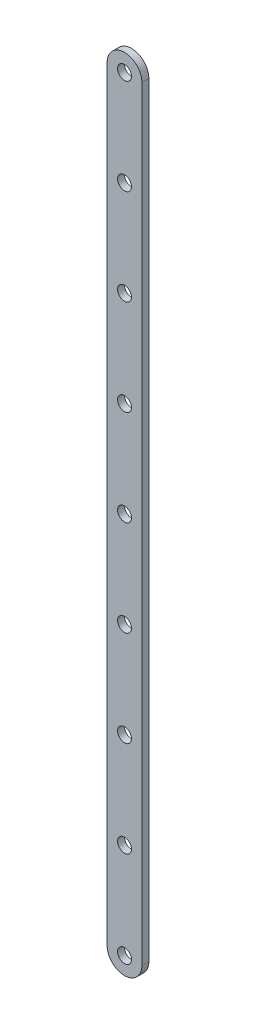
ISO-10303-21;
HEADER;
FILE_DESCRIPTION(('STEP AP214'),'2;1');
FILE_NAME('part.step','',(''),(''),'','','');
FILE_SCHEMA(('AUTOMOTIVE_DESIGN { 1 0 10303 214 1 1 1 1 }'));
ENDSEC;
DATA;
#1=APPLICATION_CONTEXT('core data for automotive mechanical design processes');
#2=APPLICATION_PROTOCOL_DEFINITION('international standard','automotive_design',2000,#1);
#3=PRODUCT_CONTEXT('',#1,'mechanical');
#4=PRODUCT('Part','Part','',(#3));
#5=PRODUCT_RELATED_PRODUCT_CATEGORY('part','',(#4));
#6=PRODUCT_DEFINITION_FORMATION('','',#4);
#7=PRODUCT_DEFINITION_CONTEXT('part definition',#1,'design');
#8=PRODUCT_DEFINITION('design','',#6,#7);
#9=PRODUCT_DEFINITION_SHAPE('','',#8);
#10=(LENGTH_UNIT() NAMED_UNIT(*) SI_UNIT(.MILLI.,.METRE.));
#11=(NAMED_UNIT(*) PLANE_ANGLE_UNIT() SI_UNIT($,.RADIAN.));
#12=(NAMED_UNIT(*) SI_UNIT($,.STERADIAN.) SOLID_ANGLE_UNIT());
#13=UNCERTAINTY_MEASURE_WITH_UNIT(LENGTH_MEASURE(1.E-05),#10,'distance_accuracy_value','');
#14=(GEOMETRIC_REPRESENTATION_CONTEXT(3) GLOBAL_UNCERTAINTY_ASSIGNED_CONTEXT((#13)) GLOBAL_UNIT_ASSIGNED_CONTEXT((#10,
#11,#12)) REPRESENTATION_CONTEXT('',''));
#15=CARTESIAN_POINT('',(0.,0.,0.));
#16=DIRECTION('',(0.,0.,1.));
#17=DIRECTION('',(1.,0.,0.));
#18=AXIS2_PLACEMENT_3D('',#15,#16,#17);
#19=CARTESIAN_POINT('',(0.,-275.,5.));
#20=DIRECTION('',(0.,0.,1.));
#21=DIRECTION('',(1.,0.,0.));
#22=AXIS2_PLACEMENT_3D('',#19,#20,#21);
#23=PLANE('',#22);
#24=CARTESIAN_POINT('',(-5.76094420909117E-12,137.5,5.));
#25=DIRECTION('',(0.,0.,1.));
#26=DIRECTION('',(1.,0.,0.));
#27=AXIS2_PLACEMENT_3D('',#24,#25,#26);
#28=CIRCLE('',#27,4.99999999999999);
#29=CARTESIAN_POINT('',(4.99999999999423,137.5,5.));
#30=VERTEX_POINT('',#29);
#31=EDGE_CURVE('E178',#30,#30,#28,.T.);
#32=ORIENTED_EDGE('',*,*,#31,.F.);
#33=EDGE_LOOP('',(#32));
#34=FACE_BOUND('',#33,.T.);
#35=CARTESIAN_POINT('',(-3.84062947272745E-12,0.,5.));
#36=DIRECTION('',(0.,0.,1.));
#37=DIRECTION('',(1.,0.,0.));
#38=AXIS2_PLACEMENT_3D('',#35,#36,#37);
#39=CIRCLE('',#38,4.99999999999999);
#40=CARTESIAN_POINT('',(4.99999999999615,0.,5.));
#41=VERTEX_POINT('',#40);
#42=EDGE_CURVE('E166',#41,#41,#39,.T.);
#43=ORIENTED_EDGE('',*,*,#42,.F.);
#44=EDGE_LOOP('',(#43));
#45=FACE_BOUND('',#44,.T.);
#46=CARTESIAN_POINT('',(-1.92031473636372E-12,-137.5,5.));
#47=DIRECTION('',(0.,0.,1.));
#48=DIRECTION('',(1.,0.,0.));
#49=AXIS2_PLACEMENT_3D('',#46,#47,#48);
#50=CIRCLE('',#49,4.99999999999999);
#51=CARTESIAN_POINT('',(4.99999999999807,-137.5,5.));
#52=VERTEX_POINT('',#51);
#53=EDGE_CURVE('E154',#52,#52,#50,.T.);
#54=ORIENTED_EDGE('',*,*,#53,.F.);
#55=EDGE_LOOP('',(#54));
#56=FACE_BOUND('',#55,.T.);
#57=CARTESIAN_POINT('',(-6.72110157727303E-12,206.25,5.));
#58=DIRECTION('',(0.,0.,1.));
#59=DIRECTION('',(1.,0.,0.));
#60=AXIS2_PLACEMENT_3D('',#57,#58,#59);
#61=CIRCLE('',#60,4.99999999999999);
#62=CARTESIAN_POINT('',(4.99999999999327,206.25,5.));
#63=VERTEX_POINT('',#62);
#64=EDGE_CURVE('E141',#63,#63,#61,.T.);
#65=ORIENTED_EDGE('',*,*,#64,.F.);
#66=EDGE_LOOP('',(#65));
#67=FACE_BOUND('',#66,.T.);
#68=CARTESIAN_POINT('',(0.,-275.,5.));
#69=DIRECTION('',(0.,0.,1.));
#70=DIRECTION('',(1.,0.,0.));
#71=AXIS2_PLACEMENT_3D('',#68,#69,#70);
#72=CIRCLE('',#71,12.5);
#73=CARTESIAN_POINT('',(-12.5,-275.,5.));
#74=VERTEX_POINT('',#73);
#75=CARTESIAN_POINT('',(12.5,-275.,5.));
#76=VERTEX_POINT('',#75);
#77=EDGE_CURVE('E105',#74,#76,#72,.T.);
#78=ORIENTED_EDGE('',*,*,#77,.T.);
#79=DIRECTION('',(0.,1.,0.));
#80=VECTOR('',#79,1.);
#81=CARTESIAN_POINT('',(12.5,-275.,5.));
#82=LINE('',#81,#80);
#83=CARTESIAN_POINT('',(12.5,275.,5.));
#84=VERTEX_POINT('',#83);
#85=EDGE_CURVE('E100',#76,#84,#82,.T.);
#86=ORIENTED_EDGE('',*,*,#85,.T.);
#87=CARTESIAN_POINT('',(0.,275.,5.));
#88=DIRECTION('',(0.,0.,1.));
#89=DIRECTION('',(-1.,0.,0.));
#90=AXIS2_PLACEMENT_3D('',#87,#88,#89);
#91=CIRCLE('',#90,12.5);
#92=CARTESIAN_POINT('',(-12.5,275.,5.));
#93=VERTEX_POINT('',#92);
#94=EDGE_CURVE('E103',#84,#93,#91,.T.);
#95=ORIENTED_EDGE('',*,*,#94,.T.);
#96=DIRECTION('',(0.,-1.,0.));
#97=VECTOR('',#96,1.);
#98=CARTESIAN_POINT('',(-12.5,-275.,5.));
#99=LINE('',#98,#97);
#100=EDGE_CURVE('E68',#93,#74,#99,.T.);
#101=ORIENTED_EDGE('',*,*,#100,.T.);
#102=EDGE_LOOP('',(#78,#86,#95,#101));
#103=FACE_BOUND('',#102,.T.);
#104=CARTESIAN_POINT('',(0.,-275.,5.));
#105=DIRECTION('',(0.,0.,1.));
#106=DIRECTION('',(1.,0.,0.));
#107=AXIS2_PLACEMENT_3D('',#104,#105,#106);
#108=CIRCLE('',#107,4.99999999999999);
#109=CARTESIAN_POINT('',(4.99999999999996,-275.,5.));
#110=VERTEX_POINT('',#109);
#111=EDGE_CURVE('E124',#110,#110,#108,.T.);
#112=ORIENTED_EDGE('',*,*,#111,.F.);
#113=EDGE_LOOP('',(#112));
#114=FACE_BOUND('',#113,.T.);
#115=CARTESIAN_POINT('',(-9.60157368181862E-13,-206.25,5.));
#116=DIRECTION('',(0.,0.,1.));
#117=DIRECTION('',(1.,0.,0.));
#118=AXIS2_PLACEMENT_3D('',#115,#116,#117);
#119=CIRCLE('',#118,4.99999999999999);
#120=CARTESIAN_POINT('',(4.99999999999903,-206.25,5.));
#121=VERTEX_POINT('',#120);
#122=EDGE_CURVE('E148',#121,#121,#119,.T.);
#123=ORIENTED_EDGE('',*,*,#122,.F.);
#124=EDGE_LOOP('',(#123));
#125=FACE_BOUND('',#124,.T.);
#126=CARTESIAN_POINT('',(-2.88047210454559E-12,-68.75,5.));
#127=DIRECTION('',(0.,0.,1.));
#128=DIRECTION('',(1.,0.,0.));
#129=AXIS2_PLACEMENT_3D('',#126,#127,#128);
#130=CIRCLE('',#129,4.99999999999999);
#131=CARTESIAN_POINT('',(4.99999999999711,-68.75,5.));
#132=VERTEX_POINT('',#131);
#133=EDGE_CURVE('E160',#132,#132,#130,.T.);
#134=ORIENTED_EDGE('',*,*,#133,.F.);
#135=EDGE_LOOP('',(#134));
#136=FACE_BOUND('',#135,.T.);
#137=CARTESIAN_POINT('',(-4.80078684090931E-12,68.75,5.));
#138=DIRECTION('',(0.,0.,1.));
#139=DIRECTION('',(1.,0.,0.));
#140=AXIS2_PLACEMENT_3D('',#137,#138,#139);
#141=CIRCLE('',#140,4.99999999999999);
#142=CARTESIAN_POINT('',(4.99999999999519,68.75,5.));
#143=VERTEX_POINT('',#142);
#144=EDGE_CURVE('E172',#143,#143,#141,.T.);
#145=ORIENTED_EDGE('',*,*,#144,.F.);
#146=EDGE_LOOP('',(#145));
#147=FACE_BOUND('',#146,.T.);
#148=CARTESIAN_POINT('',(0.,275.,5.));
#149=DIRECTION('',(0.,0.,1.));
#150=DIRECTION('',(1.,0.,0.));
#151=AXIS2_PLACEMENT_3D('',#148,#149,#150);
#152=CIRCLE('',#151,4.99999999999998);
#153=CARTESIAN_POINT('',(4.99999999999995,275.,5.));
#154=VERTEX_POINT('',#153);
#155=EDGE_CURVE('E184',#154,#154,#152,.T.);
#156=ORIENTED_EDGE('',*,*,#155,.F.);
#157=EDGE_LOOP('',(#156));
#158=FACE_BOUND('',#157,.T.);
#159=ADVANCED_FACE('F51',(#34,#45,#56,#67,#103,#114,#125,#136,#147,#158),#23,.T.);
#160=CARTESIAN_POINT('',(0.,-275.,0.));
#161=DIRECTION('',(0.,0.,1.));
#162=DIRECTION('',(1.,0.,0.));
#163=AXIS2_PLACEMENT_3D('',#160,#161,#162);
#164=PLANE('',#163);
#165=CARTESIAN_POINT('',(0.,-275.,0.));
#166=DIRECTION('',(0.,0.,1.));
#167=DIRECTION('',(1.,0.,0.));
#168=AXIS2_PLACEMENT_3D('',#165,#166,#167);
#169=CIRCLE('',#168,12.5);
#170=CARTESIAN_POINT('',(-12.5,-275.,0.));
#171=VERTEX_POINT('',#170);
#172=CARTESIAN_POINT('',(12.5,-275.,0.));
#173=VERTEX_POINT('',#172);
#174=EDGE_CURVE('E121',#171,#173,#169,.T.);
#175=ORIENTED_EDGE('',*,*,#174,.F.);
#176=DIRECTION('',(0.,-1.,0.));
#177=VECTOR('',#176,1.);
#178=CARTESIAN_POINT('',(-12.5,-275.,0.));
#179=LINE('',#178,#177);
#180=CARTESIAN_POINT('',(-12.5,275.,0.));
#181=VERTEX_POINT('',#180);
#182=EDGE_CURVE('E93',#181,#171,#179,.T.);
#183=ORIENTED_EDGE('',*,*,#182,.F.);
#184=CARTESIAN_POINT('',(0.,275.,0.));
#185=DIRECTION('',(0.,0.,1.));
#186=DIRECTION('',(-1.,0.,0.));
#187=AXIS2_PLACEMENT_3D('',#184,#185,#186);
#188=CIRCLE('',#187,12.5);
#189=CARTESIAN_POINT('',(12.5,275.,0.));
#190=VERTEX_POINT('',#189);
#191=EDGE_CURVE('E87',#190,#181,#188,.T.);
#192=ORIENTED_EDGE('',*,*,#191,.F.);
#193=DIRECTION('',(0.,1.,0.));
#194=VECTOR('',#193,1.);
#195=CARTESIAN_POINT('',(12.5,-275.,0.));
#196=LINE('',#195,#194);
#197=EDGE_CURVE('E109',#173,#190,#196,.T.);
#198=ORIENTED_EDGE('',*,*,#197,.F.);
#199=EDGE_LOOP('',(#175,#183,#192,#198));
#200=FACE_BOUND('',#199,.T.);
#201=CARTESIAN_POINT('',(0.,-275.,0.));
#202=DIRECTION('',(0.,0.,1.));
#203=DIRECTION('',(1.,0.,0.));
#204=AXIS2_PLACEMENT_3D('',#201,#202,#203);
#205=CIRCLE('',#204,4.99999999999999);
#206=CARTESIAN_POINT('',(4.99999999999996,-275.,0.));
#207=VERTEX_POINT('',#206);
#208=EDGE_CURVE('E138',#207,#207,#205,.T.);
#209=ORIENTED_EDGE('',*,*,#208,.T.);
#210=EDGE_LOOP('',(#209));
#211=FACE_BOUND('',#210,.T.);
#212=CARTESIAN_POINT('',(-6.72110157727303E-12,206.25,0.));
#213=DIRECTION('',(0.,0.,1.));
#214=DIRECTION('',(1.,0.,0.));
#215=AXIS2_PLACEMENT_3D('',#212,#213,#214);
#216=CIRCLE('',#215,4.99999999999999);
#217=CARTESIAN_POINT('',(4.99999999999327,206.25,0.));
#218=VERTEX_POINT('',#217);
#219=EDGE_CURVE('E144',#218,#218,#216,.T.);
#220=ORIENTED_EDGE('',*,*,#219,.T.);
#221=EDGE_LOOP('',(#220));
#222=FACE_BOUND('',#221,.T.);
#223=CARTESIAN_POINT('',(-9.60157368181862E-13,-206.25,0.));
#224=DIRECTION('',(0.,0.,1.));
#225=DIRECTION('',(1.,0.,0.));
#226=AXIS2_PLACEMENT_3D('',#223,#224,#225);
#227=CIRCLE('',#226,4.99999999999999);
#228=CARTESIAN_POINT('',(4.99999999999903,-206.25,0.));
#229=VERTEX_POINT('',#228);
#230=EDGE_CURVE('E151',#229,#229,#227,.T.);
#231=ORIENTED_EDGE('',*,*,#230,.T.);
#232=EDGE_LOOP('',(#231));
#233=FACE_BOUND('',#232,.T.);
#234=CARTESIAN_POINT('',(-1.92031473636372E-12,-137.5,0.));
#235=DIRECTION('',(0.,0.,1.));
#236=DIRECTION('',(1.,0.,0.));
#237=AXIS2_PLACEMENT_3D('',#234,#235,#236);
#238=CIRCLE('',#237,4.99999999999999);
#239=CARTESIAN_POINT('',(4.99999999999807,-137.5,0.));
#240=VERTEX_POINT('',#239);
#241=EDGE_CURVE('E157',#240,#240,#238,.T.);
#242=ORIENTED_EDGE('',*,*,#241,.T.);
#243=EDGE_LOOP('',(#242));
#244=FACE_BOUND('',#243,.T.);
#245=CARTESIAN_POINT('',(-2.88047210454559E-12,-68.75,0.));
#246=DIRECTION('',(0.,0.,1.));
#247=DIRECTION('',(1.,0.,0.));
#248=AXIS2_PLACEMENT_3D('',#245,#246,#247);
#249=CIRCLE('',#248,4.99999999999999);
#250=CARTESIAN_POINT('',(4.99999999999711,-68.75,0.));
#251=VERTEX_POINT('',#250);
#252=EDGE_CURVE('E163',#251,#251,#249,.T.);
#253=ORIENTED_EDGE('',*,*,#252,.T.);
#254=EDGE_LOOP('',(#253));
#255=FACE_BOUND('',#254,.T.);
#256=CARTESIAN_POINT('',(-3.84062947272745E-12,0.,0.));
#257=DIRECTION('',(0.,0.,1.));
#258=DIRECTION('',(1.,0.,0.));
#259=AXIS2_PLACEMENT_3D('',#256,#257,#258);
#260=CIRCLE('',#259,4.99999999999999);
#261=CARTESIAN_POINT('',(4.99999999999615,0.,0.));
#262=VERTEX_POINT('',#261);
#263=EDGE_CURVE('E169',#262,#262,#260,.T.);
#264=ORIENTED_EDGE('',*,*,#263,.T.);
#265=EDGE_LOOP('',(#264));
#266=FACE_BOUND('',#265,.T.);
#267=CARTESIAN_POINT('',(-4.80078684090931E-12,68.75,0.));
#268=DIRECTION('',(0.,0.,1.));
#269=DIRECTION('',(1.,0.,0.));
#270=AXIS2_PLACEMENT_3D('',#267,#268,#269);
#271=CIRCLE('',#270,4.99999999999999);
#272=CARTESIAN_POINT('',(4.99999999999519,68.75,0.));
#273=VERTEX_POINT('',#272);
#274=EDGE_CURVE('E175',#273,#273,#271,.T.);
#275=ORIENTED_EDGE('',*,*,#274,.T.);
#276=EDGE_LOOP('',(#275));
#277=FACE_BOUND('',#276,.T.);
#278=CARTESIAN_POINT('',(-5.76094420909117E-12,137.5,0.));
#279=DIRECTION('',(0.,0.,1.));
#280=DIRECTION('',(1.,0.,0.));
#281=AXIS2_PLACEMENT_3D('',#278,#279,#280);
#282=CIRCLE('',#281,4.99999999999999);
#283=CARTESIAN_POINT('',(4.99999999999423,137.5,0.));
#284=VERTEX_POINT('',#283);
#285=EDGE_CURVE('E181',#284,#284,#282,.T.);
#286=ORIENTED_EDGE('',*,*,#285,.T.);
#287=EDGE_LOOP('',(#286));
#288=FACE_BOUND('',#287,.T.);
#289=CARTESIAN_POINT('',(0.,275.,0.));
#290=DIRECTION('',(0.,0.,1.));
#291=DIRECTION('',(1.,0.,0.));
#292=AXIS2_PLACEMENT_3D('',#289,#290,#291);
#293=CIRCLE('',#292,4.99999999999998);
#294=CARTESIAN_POINT('',(4.99999999999995,275.,0.));
#295=VERTEX_POINT('',#294);
#296=EDGE_CURVE('E188',#295,#295,#293,.T.);
#297=ORIENTED_EDGE('',*,*,#296,.T.);
#298=EDGE_LOOP('',(#297));
#299=FACE_BOUND('',#298,.T.);
#300=ADVANCED_FACE('F134',(#200,#211,#222,#233,#244,#255,#266,#277,#288,#299),#164,.F.);
#301=CARTESIAN_POINT('',(0.,-275.,5.));
#302=DIRECTION('',(0.,0.,-1.));
#303=DIRECTION('',(-1.,0.,0.));
#304=AXIS2_PLACEMENT_3D('',#301,#302,#303);
#305=CYLINDRICAL_SURFACE('',#304,12.5);
#306=ORIENTED_EDGE('',*,*,#174,.T.);
#307=DIRECTION('',(0.,0.,-1.));
#308=VECTOR('',#307,1.);
#309=CARTESIAN_POINT('',(12.5,-275.,5.));
#310=LINE('',#309,#308);
#311=EDGE_CURVE('E11',#76,#173,#310,.T.);
#312=ORIENTED_EDGE('',*,*,#311,.F.);
#313=ORIENTED_EDGE('',*,*,#77,.F.);
#314=DIRECTION('',(0.,0.,-1.));
#315=VECTOR('',#314,1.);
#316=CARTESIAN_POINT('',(-12.5,-275.,5.));
#317=LINE('',#316,#315);
#318=EDGE_CURVE('E117',#74,#171,#317,.T.);
#319=ORIENTED_EDGE('',*,*,#318,.T.);
#320=EDGE_LOOP('',(#306,#312,#313,#319));
#321=FACE_BOUND('',#320,.T.);
#322=ADVANCED_FACE('F53',(#321),#305,.T.);
#323=CARTESIAN_POINT('',(12.5,-275.,5.));
#324=DIRECTION('',(-1.,0.,0.));
#325=DIRECTION('',(0.,0.,1.));
#326=AXIS2_PLACEMENT_3D('',#323,#324,#325);
#327=PLANE('',#326);
#328=ORIENTED_EDGE('',*,*,#197,.T.);
#329=DIRECTION('',(0.,0.,-1.));
#330=VECTOR('',#329,1.);
#331=CARTESIAN_POINT('',(12.5,275.,5.));
#332=LINE('',#331,#330);
#333=EDGE_CURVE('E60',#84,#190,#332,.T.);
#334=ORIENTED_EDGE('',*,*,#333,.F.);
#335=ORIENTED_EDGE('',*,*,#85,.F.);
#336=ORIENTED_EDGE('',*,*,#311,.T.);
#337=EDGE_LOOP('',(#328,#334,#335,#336));
#338=FACE_BOUND('',#337,.T.);
#339=ADVANCED_FACE('F108',(#338),#327,.F.);
#340=CARTESIAN_POINT('',(0.,275.,5.));
#341=DIRECTION('',(0.,0.,-1.));
#342=DIRECTION('',(-1.,0.,0.));
#343=AXIS2_PLACEMENT_3D('',#340,#341,#342);
#344=CYLINDRICAL_SURFACE('',#343,12.5);
#345=ORIENTED_EDGE('',*,*,#191,.T.);
#346=DIRECTION('',(0.,0.,-1.));
#347=VECTOR('',#346,1.);
#348=CARTESIAN_POINT('',(-12.5,275.,5.));
#349=LINE('',#348,#347);
#350=EDGE_CURVE('E110',#93,#181,#349,.T.);
#351=ORIENTED_EDGE('',*,*,#350,.F.);
#352=ORIENTED_EDGE('',*,*,#94,.F.);
#353=ORIENTED_EDGE('',*,*,#333,.T.);
#354=EDGE_LOOP('',(#345,#351,#352,#353));
#355=FACE_BOUND('',#354,.T.);
#356=ADVANCED_FACE('F111',(#355),#344,.T.);
#357=CARTESIAN_POINT('',(-12.5,-275.,5.));
#358=DIRECTION('',(1.,0.,0.));
#359=DIRECTION('',(0.,0.,-1.));
#360=AXIS2_PLACEMENT_3D('',#357,#358,#359);
#361=PLANE('',#360);
#362=ORIENTED_EDGE('',*,*,#182,.T.);
#363=ORIENTED_EDGE('',*,*,#318,.F.);
#364=ORIENTED_EDGE('',*,*,#100,.F.);
#365=ORIENTED_EDGE('',*,*,#350,.T.);
#366=EDGE_LOOP('',(#362,#363,#364,#365));
#367=FACE_BOUND('',#366,.T.);
#368=ADVANCED_FACE('F131',(#367),#361,.F.);
#369=CARTESIAN_POINT('',(0.,-275.,5.));
#370=DIRECTION('',(0.,0.,-1.));
#371=DIRECTION('',(-1.,0.,0.));
#372=AXIS2_PLACEMENT_3D('',#369,#370,#371);
#373=CYLINDRICAL_SURFACE('',#372,4.99999999999999);
#374=ORIENTED_EDGE('',*,*,#111,.T.);
#375=EDGE_LOOP('',(#374));
#376=FACE_BOUND('',#375,.T.);
#377=ORIENTED_EDGE('',*,*,#208,.F.);
#378=EDGE_LOOP('',(#377));
#379=FACE_BOUND('',#378,.T.);
#380=ADVANCED_FACE('F209',(#376,#379),#373,.F.);
#381=CARTESIAN_POINT('',(-6.72110157727303E-12,206.25,5.));
#382=DIRECTION('',(0.,0.,-1.));
#383=DIRECTION('',(-1.,0.,0.));
#384=AXIS2_PLACEMENT_3D('',#381,#382,#383);
#385=CYLINDRICAL_SURFACE('',#384,4.99999999999999);
#386=ORIENTED_EDGE('',*,*,#64,.T.);
#387=EDGE_LOOP('',(#386));
#388=FACE_BOUND('',#387,.T.);
#389=ORIENTED_EDGE('',*,*,#219,.F.);
#390=EDGE_LOOP('',(#389));
#391=FACE_BOUND('',#390,.T.);
#392=ADVANCED_FACE('F260',(#388,#391),#385,.F.);
#393=CARTESIAN_POINT('',(-9.60157368181862E-13,-206.25,5.));
#394=DIRECTION('',(0.,0.,-1.));
#395=DIRECTION('',(-1.,0.,0.));
#396=AXIS2_PLACEMENT_3D('',#393,#394,#395);
#397=CYLINDRICAL_SURFACE('',#396,4.99999999999999);
#398=ORIENTED_EDGE('',*,*,#122,.T.);
#399=EDGE_LOOP('',(#398));
#400=FACE_BOUND('',#399,.T.);
#401=ORIENTED_EDGE('',*,*,#230,.F.);
#402=EDGE_LOOP('',(#401));
#403=FACE_BOUND('',#402,.T.);
#404=ADVANCED_FACE('F268',(#400,#403),#397,.F.);
#405=CARTESIAN_POINT('',(-1.92031473636372E-12,-137.5,5.));
#406=DIRECTION('',(0.,0.,-1.));
#407=DIRECTION('',(-1.,0.,0.));
#408=AXIS2_PLACEMENT_3D('',#405,#406,#407);
#409=CYLINDRICAL_SURFACE('',#408,4.99999999999999);
#410=ORIENTED_EDGE('',*,*,#53,.T.);
#411=EDGE_LOOP('',(#410));
#412=FACE_BOUND('',#411,.T.);
#413=ORIENTED_EDGE('',*,*,#241,.F.);
#414=EDGE_LOOP('',(#413));
#415=FACE_BOUND('',#414,.T.);
#416=ADVANCED_FACE('F276',(#412,#415),#409,.F.);
#417=CARTESIAN_POINT('',(-2.88047210454559E-12,-68.75,5.));
#418=DIRECTION('',(0.,0.,-1.));
#419=DIRECTION('',(-1.,0.,0.));
#420=AXIS2_PLACEMENT_3D('',#417,#418,#419);
#421=CYLINDRICAL_SURFACE('',#420,4.99999999999999);
#422=ORIENTED_EDGE('',*,*,#133,.T.);
#423=EDGE_LOOP('',(#422));
#424=FACE_BOUND('',#423,.T.);
#425=ORIENTED_EDGE('',*,*,#252,.F.);
#426=EDGE_LOOP('',(#425));
#427=FACE_BOUND('',#426,.T.);
#428=ADVANCED_FACE('F285',(#424,#427),#421,.F.);
#429=CARTESIAN_POINT('',(-3.84062947272745E-12,0.,5.));
#430=DIRECTION('',(0.,0.,-1.));
#431=DIRECTION('',(-1.,0.,0.));
#432=AXIS2_PLACEMENT_3D('',#429,#430,#431);
#433=CYLINDRICAL_SURFACE('',#432,4.99999999999999);
#434=ORIENTED_EDGE('',*,*,#42,.T.);
#435=EDGE_LOOP('',(#434));
#436=FACE_BOUND('',#435,.T.);
#437=ORIENTED_EDGE('',*,*,#263,.F.);
#438=EDGE_LOOP('',(#437));
#439=FACE_BOUND('',#438,.T.);
#440=ADVANCED_FACE('F294',(#436,#439),#433,.F.);
#441=CARTESIAN_POINT('',(-4.80078684090931E-12,68.75,5.));
#442=DIRECTION('',(0.,0.,-1.));
#443=DIRECTION('',(-1.,0.,0.));
#444=AXIS2_PLACEMENT_3D('',#441,#442,#443);
#445=CYLINDRICAL_SURFACE('',#444,4.99999999999999);
#446=ORIENTED_EDGE('',*,*,#144,.T.);
#447=EDGE_LOOP('',(#446));
#448=FACE_BOUND('',#447,.T.);
#449=ORIENTED_EDGE('',*,*,#274,.F.);
#450=EDGE_LOOP('',(#449));
#451=FACE_BOUND('',#450,.T.);
#452=ADVANCED_FACE('F303',(#448,#451),#445,.F.);
#453=CARTESIAN_POINT('',(-5.76094420909117E-12,137.5,5.));
#454=DIRECTION('',(0.,0.,-1.));
#455=DIRECTION('',(-1.,0.,0.));
#456=AXIS2_PLACEMENT_3D('',#453,#454,#455);
#457=CYLINDRICAL_SURFACE('',#456,4.99999999999999);
#458=ORIENTED_EDGE('',*,*,#31,.T.);
#459=EDGE_LOOP('',(#458));
#460=FACE_BOUND('',#459,.T.);
#461=ORIENTED_EDGE('',*,*,#285,.F.);
#462=EDGE_LOOP('',(#461));
#463=FACE_BOUND('',#462,.T.);
#464=ADVANCED_FACE('F312',(#460,#463),#457,.F.);
#465=CARTESIAN_POINT('',(0.,275.,5.));
#466=DIRECTION('',(0.,0.,-1.));
#467=DIRECTION('',(-1.,0.,0.));
#468=AXIS2_PLACEMENT_3D('',#465,#466,#467);
#469=CYLINDRICAL_SURFACE('',#468,4.99999999999998);
#470=ORIENTED_EDGE('',*,*,#155,.T.);
#471=EDGE_LOOP('',(#470));
#472=FACE_BOUND('',#471,.T.);
#473=ORIENTED_EDGE('',*,*,#296,.F.);
#474=EDGE_LOOP('',(#473));
#475=FACE_BOUND('',#474,.T.);
#476=ADVANCED_FACE('F196',(#472,#475),#469,.F.);
#477=CLOSED_SHELL('',(#159,#300,#322,#339,#356,#368,#380,#392,#404,#416,#428,#440,#452,#464,#476));
#478=MANIFOLD_SOLID_BREP('B2',#477);
#479=ADVANCED_BREP_SHAPE_REPRESENTATION('',(#18,#478),#14);
#480=SHAPE_DEFINITION_REPRESENTATION(#9,#479);
ENDSEC;
END-ISO-10303-21;
